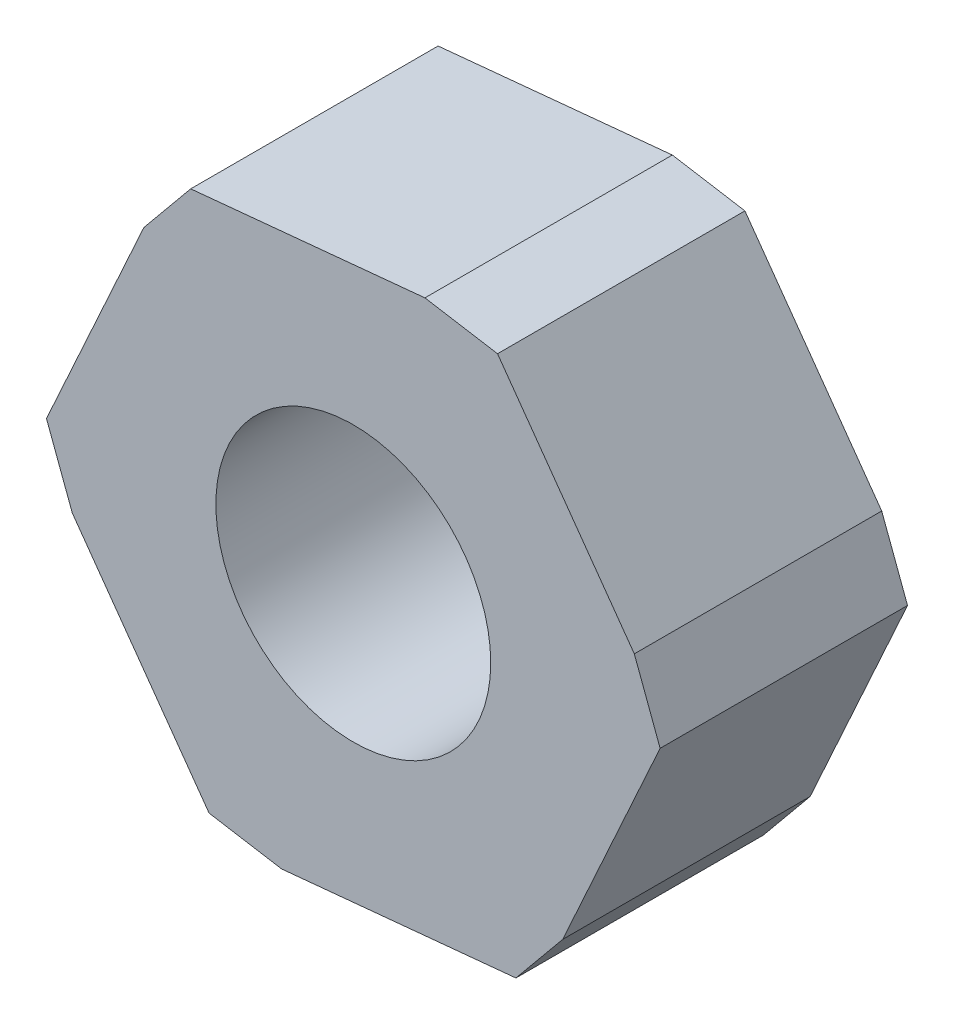
ISO-10303-21;
HEADER;
FILE_DESCRIPTION(('STEP AP214'),'2;1');
FILE_NAME('part.step','',(''),(''),'','','');
FILE_SCHEMA(('AUTOMOTIVE_DESIGN { 1 0 10303 214 1 1 1 1 }'));
ENDSEC;
DATA;
#1=APPLICATION_CONTEXT('core data for automotive mechanical design processes');
#2=APPLICATION_PROTOCOL_DEFINITION('international standard','automotive_design',2000,#1);
#3=PRODUCT_CONTEXT('',#1,'mechanical');
#4=PRODUCT('Part','Part','',(#3));
#5=PRODUCT_RELATED_PRODUCT_CATEGORY('part','',(#4));
#6=PRODUCT_DEFINITION_FORMATION('','',#4);
#7=PRODUCT_DEFINITION_CONTEXT('part definition',#1,'design');
#8=PRODUCT_DEFINITION('design','',#6,#7);
#9=PRODUCT_DEFINITION_SHAPE('','',#8);
#10=(LENGTH_UNIT() NAMED_UNIT(*) SI_UNIT(.MILLI.,.METRE.));
#11=(NAMED_UNIT(*) PLANE_ANGLE_UNIT() SI_UNIT($,.RADIAN.));
#12=(NAMED_UNIT(*) SI_UNIT($,.STERADIAN.) SOLID_ANGLE_UNIT());
#13=UNCERTAINTY_MEASURE_WITH_UNIT(LENGTH_MEASURE(1.E-05),#10,'distance_accuracy_value','');
#14=(GEOMETRIC_REPRESENTATION_CONTEXT(3) GLOBAL_UNCERTAINTY_ASSIGNED_CONTEXT((#13)) GLOBAL_UNIT_ASSIGNED_CONTEXT((#10,
#11,#12)) REPRESENTATION_CONTEXT('',''));
#15=CARTESIAN_POINT('',(0.,0.,0.));
#16=DIRECTION('',(0.,0.,1.));
#17=DIRECTION('',(1.,0.,0.));
#18=AXIS2_PLACEMENT_3D('',#15,#16,#17);
#19=CARTESIAN_POINT('',(-10.8909686572842,-3.42969269166244,4.5));
#20=DIRECTION('',(-0.0965003058071587,0.995332954834273,0.));
#21=DIRECTION('',(-0.995332954834273,-0.0965003058071588,0.));
#22=AXIS2_PLACEMENT_3D('',#19,#20,#21);
#23=PLANE('',#22);
#24=DIRECTION('',(0.995332954834273,0.0965003058071587,0.));
#25=VECTOR('',#24,1.);
#26=CARTESIAN_POINT('',(-10.8909686572842,-3.42969269166244,0.));
#27=LINE('',#26,#25);
#28=CARTESIAN_POINT('',(-9.80324857606225,-3.324235196298,0.));
#29=VERTEX_POINT('',#28);
#30=CARTESIAN_POINT('',(-5.54254434514917,-2.91114803863886,0.));
#31=VERTEX_POINT('',#30);
#32=EDGE_CURVE('E168',#29,#31,#27,.T.);
#33=ORIENTED_EDGE('',*,*,#32,.T.);
#34=DIRECTION('',(0.,0.,1.));
#35=VECTOR('',#34,1.);
#36=CARTESIAN_POINT('',(-5.54254434514917,-2.91114803863886,4.5));
#37=LINE('',#36,#35);
#38=CARTESIAN_POINT('',(-5.54254434514917,-2.91114803863886,4.5));
#39=VERTEX_POINT('',#38);
#40=EDGE_CURVE('E213',#31,#39,#37,.T.);
#41=ORIENTED_EDGE('',*,*,#40,.T.);
#42=DIRECTION('',(0.995332954834273,0.0965003058071587,0.));
#43=VECTOR('',#42,1.);
#44=CARTESIAN_POINT('',(-10.8909686572842,-3.42969269166244,4.5));
#45=LINE('',#44,#43);
#46=CARTESIAN_POINT('',(-9.80324857606225,-3.324235196298,4.5));
#47=VERTEX_POINT('',#46);
#48=EDGE_CURVE('E176',#47,#39,#45,.T.);
#49=ORIENTED_EDGE('',*,*,#48,.F.);
#50=DIRECTION('',(0.,0.,-1.));
#51=VECTOR('',#50,1.);
#52=CARTESIAN_POINT('',(-9.80324857606225,-3.324235196298,4.5));
#53=LINE('',#52,#51);
#54=EDGE_CURVE('E210',#47,#29,#53,.T.);
#55=ORIENTED_EDGE('',*,*,#54,.T.);
#56=EDGE_LOOP('',(#33,#41,#49,#55));
#57=FACE_BOUND('',#56,.T.);
#58=ADVANCED_FACE('F45',(#57),#23,.F.);
#59=CARTESIAN_POINT('',(-5.14441116321546,-2.872547916316,4.5));
#60=DIRECTION('',(-0.910233777013889,0.41409476111517,0.));
#61=DIRECTION('',(-0.414094761115171,-0.910233777013889,0.));
#62=AXIS2_PLACEMENT_3D('',#59,#60,#61);
#63=PLANE('',#62);
#64=DIRECTION('',(0.414094761115171,0.910233777013889,0.));
#65=VECTOR('',#64,1.);
#66=CARTESIAN_POINT('',(-5.14441116321546,-2.872547916316,0.));
#67=LINE('',#66,#65);
#68=CARTESIAN_POINT('',(-4.69187999260957,-1.87782594608909,0.));
#69=VERTEX_POINT('',#68);
#70=CARTESIAN_POINT('',(-2.91927184966296,2.01859573472303,0.));
#71=VERTEX_POINT('',#70);
#72=EDGE_CURVE('E163',#69,#71,#67,.T.);
#73=ORIENTED_EDGE('',*,*,#72,.T.);
#74=DIRECTION('',(0.,0.,1.));
#75=VECTOR('',#74,1.);
#76=CARTESIAN_POINT('',(-2.91927184966296,2.01859573472303,4.5));
#77=LINE('',#76,#75);
#78=CARTESIAN_POINT('',(-2.91927184966296,2.01859573472303,4.5));
#79=VERTEX_POINT('',#78);
#80=EDGE_CURVE('E141',#71,#79,#77,.T.);
#81=ORIENTED_EDGE('',*,*,#80,.T.);
#82=DIRECTION('',(0.414094761115171,0.910233777013889,0.));
#83=VECTOR('',#82,1.);
#84=CARTESIAN_POINT('',(-5.14441116321546,-2.872547916316,4.5));
#85=LINE('',#84,#83);
#86=CARTESIAN_POINT('',(-4.69187999260957,-1.87782594608909,4.5));
#87=VERTEX_POINT('',#86);
#88=EDGE_CURVE('E252',#87,#79,#85,.T.);
#89=ORIENTED_EDGE('',*,*,#88,.F.);
#90=DIRECTION('',(0.,0.,-1.));
#91=VECTOR('',#90,1.);
#92=CARTESIAN_POINT('',(-4.69187999260957,-1.87782594608909,4.5));
#93=LINE('',#92,#91);
#94=EDGE_CURVE('E146',#87,#69,#93,.T.);
#95=ORIENTED_EDGE('',*,*,#94,.T.);
#96=EDGE_LOOP('',(#73,#81,#89,#95));
#97=FACE_BOUND('',#96,.T.);
#98=ADVANCED_FACE('F254',(#97),#63,.F.);
#99=CARTESIAN_POINT('',(-2.75363394521689,2.38268924552859,4.5));
#100=DIRECTION('',(-0.813733471206731,-0.581238193719103,0.));
#101=DIRECTION('',(0.581238193719103,-0.813733471206731,0.));
#102=AXIS2_PLACEMENT_3D('',#99,#100,#101);
#103=PLANE('',#102);
#104=DIRECTION('',(-0.581238193719103,0.813733471206731,0.));
#105=VECTOR('',#104,1.);
#106=CARTESIAN_POINT('',(-2.75363394521689,2.38268924552859,4.5));
#107=LINE('',#106,#105);
#108=CARTESIAN_POINT('',(-3.38882285583295,3.27195372039106,4.5));
#109=VERTEX_POINT('',#108);
#110=CARTESIAN_POINT('',(-5.8769189437994,6.75528824354404,4.5));
#111=VERTEX_POINT('',#110);
#112=EDGE_CURVE('E156',#109,#111,#107,.T.);
#113=ORIENTED_EDGE('',*,*,#112,.F.);
#114=DIRECTION('',(0.,0.,-1.));
#115=VECTOR('',#114,1.);
#116=CARTESIAN_POINT('',(-3.38882285583295,3.27195372039106,4.5));
#117=LINE('',#116,#115);
#118=CARTESIAN_POINT('',(-3.38882285583295,3.27195372039106,0.));
#119=VERTEX_POINT('',#118);
#120=EDGE_CURVE('E140',#109,#119,#117,.T.);
#121=ORIENTED_EDGE('',*,*,#120,.T.);
#122=DIRECTION('',(-0.581238193719103,0.813733471206731,0.));
#123=VECTOR('',#122,1.);
#124=CARTESIAN_POINT('',(-2.75363394521689,2.38268924552859,0.));
#125=LINE('',#124,#123);
#126=CARTESIAN_POINT('',(-5.8769189437994,6.75528824354404,0.));
#127=VERTEX_POINT('',#126);
#128=EDGE_CURVE('E153',#119,#127,#125,.T.);
#129=ORIENTED_EDGE('',*,*,#128,.T.);
#130=DIRECTION('',(0.,0.,1.));
#131=VECTOR('',#130,1.);
#132=CARTESIAN_POINT('',(-5.8769189437994,6.75528824354404,4.5));
#133=LINE('',#132,#131);
#134=EDGE_CURVE('E158',#127,#111,#133,.T.);
#135=ORIENTED_EDGE('',*,*,#134,.T.);
#136=EDGE_LOOP('',(#113,#121,#129,#135));
#137=FACE_BOUND('',#136,.T.);
#138=ADVANCED_FACE('F152',(#137),#103,.F.);
#139=CARTESIAN_POINT('',(-6.10941422128704,7.08078163202673,4.5));
#140=DIRECTION('',(0.0965003058071583,-0.995332954834273,0.));
#141=DIRECTION('',(0.995332954834273,0.0965003058071583,0.));
#142=AXIS2_PLACEMENT_3D('',#139,#140,#141);
#143=PLANE('',#142);
#144=DIRECTION('',(-0.995332954834273,-0.0965003058071583,0.));
#145=VECTOR('',#144,1.);
#146=CARTESIAN_POINT('',(-6.10941422128704,7.08078163202673,4.5));
#147=LINE('',#146,#145);
#148=CARTESIAN_POINT('',(-7.197134302509,6.9753241366623,4.5));
#149=VERTEX_POINT('',#148);
#150=CARTESIAN_POINT('',(-11.4578385334221,6.56223697900316,4.5));
#151=VERTEX_POINT('',#150);
#152=EDGE_CURVE('E235',#149,#151,#147,.T.);
#153=ORIENTED_EDGE('',*,*,#152,.F.);
#154=DIRECTION('',(0.,0.,-1.));
#155=VECTOR('',#154,1.);
#156=CARTESIAN_POINT('',(-7.197134302509,6.9753241366623,4.5));
#157=LINE('',#156,#155);
#158=CARTESIAN_POINT('',(-7.197134302509,6.9753241366623,0.));
#159=VERTEX_POINT('',#158);
#160=EDGE_CURVE('E207',#149,#159,#157,.T.);
#161=ORIENTED_EDGE('',*,*,#160,.T.);
#162=DIRECTION('',(-0.995332954834273,-0.0965003058071583,0.));
#163=VECTOR('',#162,1.);
#164=CARTESIAN_POINT('',(-6.10941422128704,7.08078163202673,0.));
#165=LINE('',#164,#163);
#166=CARTESIAN_POINT('',(-11.4578385334221,6.56223697900316,0.));
#167=VERTEX_POINT('',#166);
#168=EDGE_CURVE('E162',#159,#167,#165,.T.);
#169=ORIENTED_EDGE('',*,*,#168,.T.);
#170=DIRECTION('',(0.,0.,1.));
#171=VECTOR('',#170,1.);
#172=CARTESIAN_POINT('',(-11.4578385334221,6.56223697900316,4.5));
#173=LINE('',#172,#171);
#174=EDGE_CURVE('E205',#167,#151,#173,.T.);
#175=ORIENTED_EDGE('',*,*,#174,.T.);
#176=EDGE_LOOP('',(#153,#161,#169,#175));
#177=FACE_BOUND('',#176,.T.);
#178=ADVANCED_FACE('F265',(#177),#143,.F.);
#179=CARTESIAN_POINT('',(-11.8559717153558,6.52363685668029,4.5));
#180=DIRECTION('',(0.910233777013889,-0.41409476111517,0.));
#181=DIRECTION('',(0.41409476111517,0.910233777013889,0.));
#182=AXIS2_PLACEMENT_3D('',#179,#180,#181);
#183=PLANE('',#182);
#184=DIRECTION('',(-0.41409476111517,-0.910233777013889,0.));
#185=VECTOR('',#184,1.);
#186=CARTESIAN_POINT('',(-11.8559717153558,6.52363685668029,0.));
#187=LINE('',#186,#185);
#188=CARTESIAN_POINT('',(-12.3085028859617,5.52891488645339,0.));
#189=VERTEX_POINT('',#188);
#190=CARTESIAN_POINT('',(-14.0811110289083,1.63249320564126,0.));
#191=VERTEX_POINT('',#190);
#192=EDGE_CURVE('E166',#189,#191,#187,.T.);
#193=ORIENTED_EDGE('',*,*,#192,.T.);
#194=DIRECTION('',(0.,0.,1.));
#195=VECTOR('',#194,1.);
#196=CARTESIAN_POINT('',(-14.0811110289083,1.63249320564126,4.5));
#197=LINE('',#196,#195);
#198=CARTESIAN_POINT('',(-14.0811110289083,1.63249320564126,4.5));
#199=VERTEX_POINT('',#198);
#200=EDGE_CURVE('E11',#191,#199,#197,.T.);
#201=ORIENTED_EDGE('',*,*,#200,.T.);
#202=DIRECTION('',(-0.41409476111517,-0.910233777013889,0.));
#203=VECTOR('',#202,1.);
#204=CARTESIAN_POINT('',(-11.8559717153558,6.52363685668029,4.5));
#205=LINE('',#204,#203);
#206=CARTESIAN_POINT('',(-12.3085028859617,5.52891488645339,4.5));
#207=VERTEX_POINT('',#206);
#208=EDGE_CURVE('E225',#207,#199,#205,.T.);
#209=ORIENTED_EDGE('',*,*,#208,.F.);
#210=DIRECTION('',(0.,0.,-1.));
#211=VECTOR('',#210,1.);
#212=CARTESIAN_POINT('',(-12.3085028859617,5.52891488645339,4.5));
#213=LINE('',#212,#211);
#214=EDGE_CURVE('E54',#207,#189,#213,.T.);
#215=ORIENTED_EDGE('',*,*,#214,.T.);
#216=EDGE_LOOP('',(#193,#201,#209,#215));
#217=FACE_BOUND('',#216,.T.);
#218=ADVANCED_FACE('F223',(#217),#183,.F.);
#219=CARTESIAN_POINT('',(-14.2467489333544,1.26839969483571,4.5));
#220=DIRECTION('',(0.813733471206731,0.581238193719102,0.));
#221=DIRECTION('',(-0.581238193719102,0.813733471206731,0.));
#222=AXIS2_PLACEMENT_3D('',#219,#220,#221);
#223=PLANE('',#222);
#224=DIRECTION('',(0.581238193719102,-0.813733471206731,0.));
#225=VECTOR('',#224,1.);
#226=CARTESIAN_POINT('',(-14.2467489333544,1.26839969483571,0.));
#227=LINE('',#226,#225);
#228=CARTESIAN_POINT('',(-13.6115600227383,0.379135219973245,0.));
#229=VERTEX_POINT('',#228);
#230=CARTESIAN_POINT('',(-11.1234639347718,-3.10419930317974,0.));
#231=VERTEX_POINT('',#230);
#232=EDGE_CURVE('E174',#229,#231,#227,.T.);
#233=ORIENTED_EDGE('',*,*,#232,.T.);
#234=DIRECTION('',(0.,0.,1.));
#235=VECTOR('',#234,1.);
#236=CARTESIAN_POINT('',(-11.1234639347718,-3.10419930317974,4.5));
#237=LINE('',#236,#235);
#238=CARTESIAN_POINT('',(-11.1234639347718,-3.10419930317974,4.5));
#239=VERTEX_POINT('',#238);
#240=EDGE_CURVE('E61',#231,#239,#237,.T.);
#241=ORIENTED_EDGE('',*,*,#240,.T.);
#242=DIRECTION('',(0.581238193719102,-0.813733471206731,0.));
#243=VECTOR('',#242,1.);
#244=CARTESIAN_POINT('',(-14.2467489333544,1.26839969483571,4.5));
#245=LINE('',#244,#243);
#246=CARTESIAN_POINT('',(-13.6115600227383,0.379135219973245,4.5));
#247=VERTEX_POINT('',#246);
#248=EDGE_CURVE('E181',#247,#239,#245,.T.);
#249=ORIENTED_EDGE('',*,*,#248,.F.);
#250=DIRECTION('',(0.,0.,-1.));
#251=VECTOR('',#250,1.);
#252=CARTESIAN_POINT('',(-13.6115600227383,0.379135219973245,4.5));
#253=LINE('',#252,#251);
#254=EDGE_CURVE('E215',#247,#229,#253,.T.);
#255=ORIENTED_EDGE('',*,*,#254,.T.);
#256=EDGE_LOOP('',(#233,#241,#249,#255));
#257=FACE_BOUND('',#256,.T.);
#258=ADVANCED_FACE('F232',(#257),#223,.F.);
#259=CARTESIAN_POINT('',(0.,0.,4.5));
#260=DIRECTION('',(0.,0.,1.));
#261=DIRECTION('',(1.,0.,0.));
#262=AXIS2_PLACEMENT_3D('',#259,#260,#261);
#263=PLANE('',#262);
#264=CARTESIAN_POINT('',(-8.50019143928562,1.82554447018215,4.5));
#265=DIRECTION('',(0.,0.,1.));
#266=DIRECTION('',(1.,0.,0.));
#267=AXIS2_PLACEMENT_3D('',#264,#265,#266);
#268=CIRCLE('',#267,2.5);
#269=CARTESIAN_POINT('',(-6.00019143928562,1.82554447018215,4.5));
#270=VERTEX_POINT('',#269);
#271=EDGE_CURVE('E180',#270,#270,#268,.T.);
#272=ORIENTED_EDGE('',*,*,#271,.F.);
#273=EDGE_LOOP('',(#272));
#274=FACE_BOUND('',#273,.T.);
#275=ORIENTED_EDGE('',*,*,#88,.T.);
#276=DIRECTION('',(0.350823262553203,-0.936441689829926,0.));
#277=VECTOR('',#276,1.);
#278=CARTESIAN_POINT('',(-1.89681650925489,-0.710612698546594,4.5));
#279=LINE('',#278,#277);
#280=EDGE_CURVE('E203',#79,#109,#279,.F.);
#281=ORIENTED_EDGE('',*,*,#280,.T.);
#282=ORIENTED_EDGE('',*,*,#112,.T.);
#283=DIRECTION('',(0.986393923832145,-0.164398987305352,0.));
#284=VECTOR('',#283,1.);
#285=CARTESIAN_POINT('',(0.936616500471998,5.61969900283218,4.5));
#286=LINE('',#285,#284);
#287=EDGE_CURVE('E201',#111,#149,#286,.F.);
#288=ORIENTED_EDGE('',*,*,#287,.T.);
#289=ORIENTED_EDGE('',*,*,#152,.T.);
#290=DIRECTION('',(0.635570661278943,0.772042702524573,0.));
#291=VECTOR('',#290,1.);
#292=CARTESIAN_POINT('',(-10.0494528184884,8.27303639093064,4.5));
#293=LINE('',#292,#291);
#294=EDGE_CURVE('E194',#151,#207,#293,.F.);
#295=ORIENTED_EDGE('',*,*,#294,.T.);
#296=ORIENTED_EDGE('',*,*,#208,.T.);
#297=DIRECTION('',(-0.350823262553202,0.936441689829926,0.));
#298=VECTOR('',#297,1.);
#299=CARTESIAN_POINT('',(-11.8117349745702,-4.42508214360369,4.5));
#300=LINE('',#299,#298);
#301=EDGE_CURVE('E68',#199,#247,#300,.F.);
#302=ORIENTED_EDGE('',*,*,#301,.T.);
#303=ORIENTED_EDGE('',*,*,#248,.T.);
#304=DIRECTION('',(-0.986393923832145,0.164398987305353,0.));
#305=VECTOR('',#304,1.);
#306=CARTESIAN_POINT('',(-0.804017831185113,-4.82410698711082,4.5));
#307=LINE('',#306,#305);
#308=EDGE_CURVE('E197',#239,#47,#307,.F.);
#309=ORIENTED_EDGE('',*,*,#308,.T.);
#310=ORIENTED_EDGE('',*,*,#48,.T.);
#311=DIRECTION('',(-0.635570661278942,-0.772042702524575,0.));
#312=VECTOR('',#311,1.);
#313=CARTESIAN_POINT('',(-1.87516868483028,1.54369984604473,4.5));
#314=LINE('',#313,#312);
#315=EDGE_CURVE('E199',#39,#87,#314,.F.);
#316=ORIENTED_EDGE('',*,*,#315,.T.);
#317=EDGE_LOOP('',(#275,#281,#282,#288,#289,#295,#296,#302,#303,#309,#310,#316));
#318=FACE_BOUND('',#317,.T.);
#319=ADVANCED_FACE('F251',(#274,#318),#263,.T.);
#320=CARTESIAN_POINT('',(0.,0.,0.));
#321=DIRECTION('',(0.,0.,1.));
#322=DIRECTION('',(1.,0.,0.));
#323=AXIS2_PLACEMENT_3D('',#320,#321,#322);
#324=PLANE('',#323);
#325=CARTESIAN_POINT('',(-8.50019143928562,1.82554447018215,0.));
#326=DIRECTION('',(0.,0.,1.));
#327=DIRECTION('',(1.,0.,0.));
#328=AXIS2_PLACEMENT_3D('',#325,#326,#327);
#329=CIRCLE('',#328,2.5);
#330=CARTESIAN_POINT('',(-6.00019143928562,1.82554447018215,0.));
#331=VERTEX_POINT('',#330);
#332=EDGE_CURVE('E177',#331,#331,#329,.T.);
#333=ORIENTED_EDGE('',*,*,#332,.T.);
#334=EDGE_LOOP('',(#333));
#335=FACE_BOUND('',#334,.T.);
#336=ORIENTED_EDGE('',*,*,#128,.F.);
#337=DIRECTION('',(-0.350823262553203,0.936441689829926,0.));
#338=VECTOR('',#337,1.);
#339=CARTESIAN_POINT('',(-3.38882285583295,3.27195372039106,0.));
#340=LINE('',#339,#338);
#341=EDGE_CURVE('E136',#119,#71,#340,.F.);
#342=ORIENTED_EDGE('',*,*,#341,.T.);
#343=ORIENTED_EDGE('',*,*,#72,.F.);
#344=DIRECTION('',(0.635570661278942,0.772042702524575,0.));
#345=VECTOR('',#344,1.);
#346=CARTESIAN_POINT('',(-4.69187999260957,-1.87782594608909,0.));
#347=LINE('',#346,#345);
#348=EDGE_CURVE('E188',#69,#31,#347,.F.);
#349=ORIENTED_EDGE('',*,*,#348,.T.);
#350=ORIENTED_EDGE('',*,*,#32,.F.);
#351=DIRECTION('',(0.986393923832145,-0.164398987305353,0.));
#352=VECTOR('',#351,1.);
#353=CARTESIAN_POINT('',(-9.80324857606225,-3.324235196298,0.));
#354=LINE('',#353,#352);
#355=EDGE_CURVE('E186',#29,#231,#354,.F.);
#356=ORIENTED_EDGE('',*,*,#355,.T.);
#357=ORIENTED_EDGE('',*,*,#232,.F.);
#358=DIRECTION('',(0.350823262553202,-0.936441689829926,0.));
#359=VECTOR('',#358,1.);
#360=CARTESIAN_POINT('',(-13.6115600227383,0.379135219973245,0.));
#361=LINE('',#360,#359);
#362=EDGE_CURVE('E184',#229,#191,#361,.F.);
#363=ORIENTED_EDGE('',*,*,#362,.T.);
#364=ORIENTED_EDGE('',*,*,#192,.F.);
#365=DIRECTION('',(-0.635570661278943,-0.772042702524573,0.));
#366=VECTOR('',#365,1.);
#367=CARTESIAN_POINT('',(-12.3085028859617,5.52891488645339,0.));
#368=LINE('',#367,#366);
#369=EDGE_CURVE('E157',#189,#167,#368,.F.);
#370=ORIENTED_EDGE('',*,*,#369,.T.);
#371=ORIENTED_EDGE('',*,*,#168,.F.);
#372=DIRECTION('',(-0.986393923832145,0.164398987305352,0.));
#373=VECTOR('',#372,1.);
#374=CARTESIAN_POINT('',(-7.197134302509,6.9753241366623,0.));
#375=LINE('',#374,#373);
#376=EDGE_CURVE('E147',#159,#127,#375,.F.);
#377=ORIENTED_EDGE('',*,*,#376,.T.);
#378=EDGE_LOOP('',(#336,#342,#343,#349,#350,#356,#357,#363,#364,#370,#371,#377));
#379=FACE_BOUND('',#378,.T.);
#380=ADVANCED_FACE('F160',(#335,#379),#324,.F.);
#381=CARTESIAN_POINT('',(-8.50019143928562,1.82554447018215,-3.));
#382=DIRECTION('',(0.,0.,1.));
#383=DIRECTION('',(1.,0.,0.));
#384=AXIS2_PLACEMENT_3D('',#381,#382,#383);
#385=CYLINDRICAL_SURFACE('',#384,2.5);
#386=ORIENTED_EDGE('',*,*,#271,.T.);
#387=EDGE_LOOP('',(#386));
#388=FACE_BOUND('',#387,.T.);
#389=ORIENTED_EDGE('',*,*,#332,.F.);
#390=EDGE_LOOP('',(#389));
#391=FACE_BOUND('',#390,.T.);
#392=ADVANCED_FACE('F276',(#388,#391),#385,.F.);
#393=CARTESIAN_POINT('',(-3.38882285583295,3.27195372039106,4.5));
#394=DIRECTION('',(-0.936441689829926,-0.350823262553203,0.));
#395=DIRECTION('',(0.,0.,-1.));
#396=AXIS2_PLACEMENT_3D('',#393,#394,#395);
#397=PLANE('',#396);
#398=ORIENTED_EDGE('',*,*,#280,.F.);
#399=ORIENTED_EDGE('',*,*,#80,.F.);
#400=ORIENTED_EDGE('',*,*,#341,.F.);
#401=ORIENTED_EDGE('',*,*,#120,.F.);
#402=EDGE_LOOP('',(#398,#399,#400,#401));
#403=FACE_BOUND('',#402,.T.);
#404=ADVANCED_FACE('F139',(#403),#397,.F.);
#405=CARTESIAN_POINT('',(-7.197134302509,6.9753241366623,4.5));
#406=DIRECTION('',(-0.164398987305352,-0.986393923832145,0.));
#407=DIRECTION('',(0.,0.,-1.));
#408=AXIS2_PLACEMENT_3D('',#405,#406,#407);
#409=PLANE('',#408);
#410=ORIENTED_EDGE('',*,*,#287,.F.);
#411=ORIENTED_EDGE('',*,*,#134,.F.);
#412=ORIENTED_EDGE('',*,*,#376,.F.);
#413=ORIENTED_EDGE('',*,*,#160,.F.);
#414=EDGE_LOOP('',(#410,#411,#412,#413));
#415=FACE_BOUND('',#414,.T.);
#416=ADVANCED_FACE('F267',(#415),#409,.F.);
#417=CARTESIAN_POINT('',(-4.69187999260957,-1.87782594608909,4.5));
#418=DIRECTION('',(-0.772042702524574,0.635570661278942,0.));
#419=DIRECTION('',(0.,0.,-1.));
#420=AXIS2_PLACEMENT_3D('',#417,#418,#419);
#421=PLANE('',#420);
#422=ORIENTED_EDGE('',*,*,#315,.F.);
#423=ORIENTED_EDGE('',*,*,#40,.F.);
#424=ORIENTED_EDGE('',*,*,#348,.F.);
#425=ORIENTED_EDGE('',*,*,#94,.F.);
#426=EDGE_LOOP('',(#422,#423,#424,#425));
#427=FACE_BOUND('',#426,.T.);
#428=ADVANCED_FACE('F247',(#427),#421,.F.);
#429=CARTESIAN_POINT('',(-9.80324857606225,-3.324235196298,4.5));
#430=DIRECTION('',(0.164398987305353,0.986393923832145,0.));
#431=DIRECTION('',(0.,0.,-1.));
#432=AXIS2_PLACEMENT_3D('',#429,#430,#431);
#433=PLANE('',#432);
#434=ORIENTED_EDGE('',*,*,#308,.F.);
#435=ORIENTED_EDGE('',*,*,#240,.F.);
#436=ORIENTED_EDGE('',*,*,#355,.F.);
#437=ORIENTED_EDGE('',*,*,#54,.F.);
#438=EDGE_LOOP('',(#434,#435,#436,#437));
#439=FACE_BOUND('',#438,.T.);
#440=ADVANCED_FACE('F274',(#439),#433,.F.);
#441=CARTESIAN_POINT('',(-13.6115600227383,0.379135219973245,4.5));
#442=DIRECTION('',(0.936441689829926,0.350823262553202,0.));
#443=DIRECTION('',(0.,0.,-1.));
#444=AXIS2_PLACEMENT_3D('',#441,#442,#443);
#445=PLANE('',#444);
#446=ORIENTED_EDGE('',*,*,#301,.F.);
#447=ORIENTED_EDGE('',*,*,#200,.F.);
#448=ORIENTED_EDGE('',*,*,#362,.F.);
#449=ORIENTED_EDGE('',*,*,#254,.F.);
#450=EDGE_LOOP('',(#446,#447,#448,#449));
#451=FACE_BOUND('',#450,.T.);
#452=ADVANCED_FACE('F231',(#451),#445,.F.);
#453=CARTESIAN_POINT('',(-12.3085028859617,5.52891488645339,4.5));
#454=DIRECTION('',(0.772042702524573,-0.635570661278943,0.));
#455=DIRECTION('',(0.,0.,-1.));
#456=AXIS2_PLACEMENT_3D('',#453,#454,#455);
#457=PLANE('',#456);
#458=ORIENTED_EDGE('',*,*,#294,.F.);
#459=ORIENTED_EDGE('',*,*,#174,.F.);
#460=ORIENTED_EDGE('',*,*,#369,.F.);
#461=ORIENTED_EDGE('',*,*,#214,.F.);
#462=EDGE_LOOP('',(#458,#459,#460,#461));
#463=FACE_BOUND('',#462,.T.);
#464=ADVANCED_FACE('F48',(#463),#457,.F.);
#465=CLOSED_SHELL('',(#58,#98,#138,#178,#218,#258,#319,#380,#392,#404,#416,#428,#440,#452,#464));
#466=MANIFOLD_SOLID_BREP('B2',#465);
#467=ADVANCED_BREP_SHAPE_REPRESENTATION('',(#18,#466),#14);
#468=SHAPE_DEFINITION_REPRESENTATION(#9,#467);
ENDSEC;
END-ISO-10303-21;
